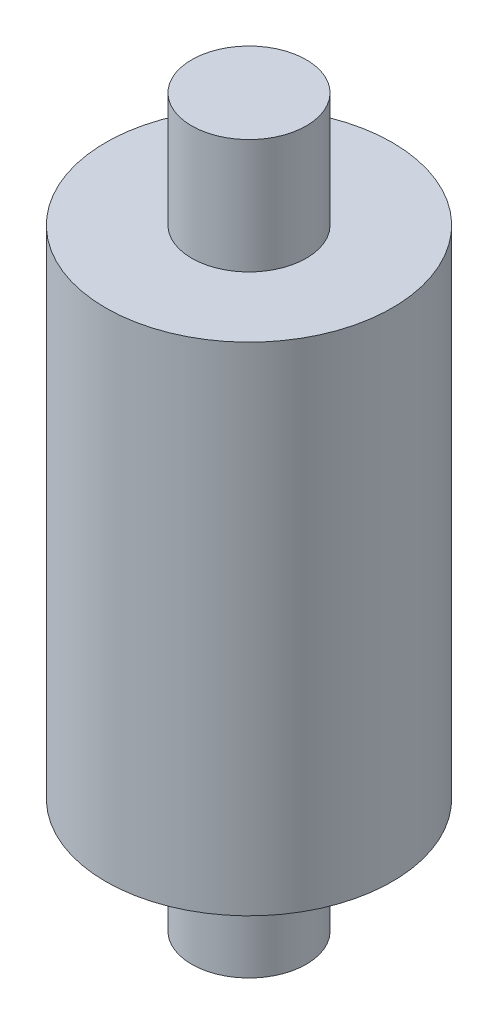
ISO-10303-21;
HEADER;
FILE_DESCRIPTION(('STEP AP214'),'2;1');
FILE_NAME('part.step','',(''),(''),'','','');
FILE_SCHEMA(('AUTOMOTIVE_DESIGN { 1 0 10303 214 1 1 1 1 }'));
ENDSEC;
DATA;
#1=APPLICATION_CONTEXT('core data for automotive mechanical design processes');
#2=APPLICATION_PROTOCOL_DEFINITION('international standard','automotive_design',2000,#1);
#3=PRODUCT_CONTEXT('',#1,'mechanical');
#4=PRODUCT('Part','Part','',(#3));
#5=PRODUCT_RELATED_PRODUCT_CATEGORY('part','',(#4));
#6=PRODUCT_DEFINITION_FORMATION('','',#4);
#7=PRODUCT_DEFINITION_CONTEXT('part definition',#1,'design');
#8=PRODUCT_DEFINITION('design','',#6,#7);
#9=PRODUCT_DEFINITION_SHAPE('','',#8);
#10=(LENGTH_UNIT() NAMED_UNIT(*) SI_UNIT(.MILLI.,.METRE.));
#11=(NAMED_UNIT(*) PLANE_ANGLE_UNIT() SI_UNIT($,.RADIAN.));
#12=(NAMED_UNIT(*) SI_UNIT($,.STERADIAN.) SOLID_ANGLE_UNIT());
#13=UNCERTAINTY_MEASURE_WITH_UNIT(LENGTH_MEASURE(1.E-05),#10,'distance_accuracy_value','');
#14=(GEOMETRIC_REPRESENTATION_CONTEXT(3) GLOBAL_UNCERTAINTY_ASSIGNED_CONTEXT((#13)) GLOBAL_UNIT_ASSIGNED_CONTEXT((#10,
#11,#12)) REPRESENTATION_CONTEXT('',''));
#15=CARTESIAN_POINT('',(0.,0.,0.));
#16=DIRECTION('',(0.,0.,1.));
#17=DIRECTION('',(1.,0.,0.));
#18=AXIS2_PLACEMENT_3D('',#15,#16,#17);
#19=CARTESIAN_POINT('',(0.,19.,0.));
#20=DIRECTION('',(0.,-1.,0.));
#21=DIRECTION('',(0.,0.,-1.));
#22=AXIS2_PLACEMENT_3D('',#19,#20,#21);
#23=CYLINDRICAL_SURFACE('',#22,3.);
#24=CARTESIAN_POINT('',(0.,13.,0.));
#25=DIRECTION('',(0.,1.,0.));
#26=DIRECTION('',(0.,0.,1.));
#27=AXIS2_PLACEMENT_3D('',#24,#25,#26);
#28=CIRCLE('',#27,3.);
#29=CARTESIAN_POINT('',(0.,13.,3.));
#30=VERTEX_POINT('',#29);
#31=EDGE_CURVE('E61',#30,#30,#28,.T.);
#32=ORIENTED_EDGE('',*,*,#31,.T.);
#33=EDGE_LOOP('',(#32));
#34=FACE_BOUND('',#33,.T.);
#35=CARTESIAN_POINT('',(0.,19.,0.));
#36=DIRECTION('',(0.,1.,0.));
#37=DIRECTION('',(0.,0.,1.));
#38=AXIS2_PLACEMENT_3D('',#35,#36,#37);
#39=CIRCLE('',#38,3.);
#40=CARTESIAN_POINT('',(0.,19.,3.));
#41=VERTEX_POINT('',#40);
#42=EDGE_CURVE('E44',#41,#41,#39,.T.);
#43=ORIENTED_EDGE('',*,*,#42,.F.);
#44=EDGE_LOOP('',(#43));
#45=FACE_BOUND('',#44,.T.);
#46=ADVANCED_FACE('F37',(#34,#45),#23,.T.);
#47=CARTESIAN_POINT('',(0.,19.,0.));
#48=DIRECTION('',(0.,1.,0.));
#49=DIRECTION('',(0.,0.,1.));
#50=AXIS2_PLACEMENT_3D('',#47,#48,#49);
#51=PLANE('',#50);
#52=ORIENTED_EDGE('',*,*,#42,.T.);
#53=EDGE_LOOP('',(#52));
#54=FACE_BOUND('',#53,.T.);
#55=ADVANCED_FACE('F74',(#54),#51,.T.);
#56=CARTESIAN_POINT('',(0.,13.,0.));
#57=DIRECTION('',(0.,1.,0.));
#58=DIRECTION('',(0.,0.,1.));
#59=AXIS2_PLACEMENT_3D('',#56,#57,#58);
#60=PLANE('',#59);
#61=CARTESIAN_POINT('',(0.,13.,0.));
#62=DIRECTION('',(0.,1.,0.));
#63=DIRECTION('',(0.,0.,1.));
#64=AXIS2_PLACEMENT_3D('',#61,#62,#63);
#65=CIRCLE('',#64,7.5);
#66=CARTESIAN_POINT('',(0.,13.,-7.5));
#67=VERTEX_POINT('',#66);
#68=EDGE_CURVE('E55',#67,#67,#65,.T.);
#69=ORIENTED_EDGE('',*,*,#68,.T.);
#70=EDGE_LOOP('',(#69));
#71=FACE_BOUND('',#70,.T.);
#72=ORIENTED_EDGE('',*,*,#31,.F.);
#73=EDGE_LOOP('',(#72));
#74=FACE_BOUND('',#73,.T.);
#75=ADVANCED_FACE('F71',(#71,#74),#60,.T.);
#76=CARTESIAN_POINT('',(0.,-13.,0.));
#77=DIRECTION('',(0.,1.,0.));
#78=DIRECTION('',(0.,0.,1.));
#79=AXIS2_PLACEMENT_3D('',#76,#77,#78);
#80=PLANE('',#79);
#81=CARTESIAN_POINT('',(0.,-13.,0.));
#82=DIRECTION('',(0.,1.,0.));
#83=DIRECTION('',(0.,0.,1.));
#84=AXIS2_PLACEMENT_3D('',#81,#82,#83);
#85=CIRCLE('',#84,7.5);
#86=CARTESIAN_POINT('',(0.,-13.,-7.5));
#87=VERTEX_POINT('',#86);
#88=EDGE_CURVE('E57',#87,#87,#85,.T.);
#89=ORIENTED_EDGE('',*,*,#88,.F.);
#90=EDGE_LOOP('',(#89));
#91=FACE_BOUND('',#90,.T.);
#92=CARTESIAN_POINT('',(0.,-13.,0.));
#93=DIRECTION('',(0.,1.,0.));
#94=DIRECTION('',(0.,0.,1.));
#95=AXIS2_PLACEMENT_3D('',#92,#93,#94);
#96=CIRCLE('',#95,3.);
#97=CARTESIAN_POINT('',(0.,-13.,3.));
#98=VERTEX_POINT('',#97);
#99=EDGE_CURVE('E10',#98,#98,#96,.T.);
#100=ORIENTED_EDGE('',*,*,#99,.T.);
#101=EDGE_LOOP('',(#100));
#102=FACE_BOUND('',#101,.T.);
#103=ADVANCED_FACE('F73',(#91,#102),#80,.F.);
#104=CARTESIAN_POINT('',(0.,13.,0.));
#105=DIRECTION('',(0.,-1.,0.));
#106=DIRECTION('',(0.,0.,-1.));
#107=AXIS2_PLACEMENT_3D('',#104,#105,#106);
#108=CYLINDRICAL_SURFACE('',#107,7.5);
#109=CARTESIAN_POINT('',(0.,13.,-7.5));
#110=CARTESIAN_POINT('',(0.,12.7291666666667,-7.5));
#111=CARTESIAN_POINT('',(0.,12.4583333333333,-7.5));
#112=CARTESIAN_POINT('',(0.,11.9166666666667,-7.5));
#113=CARTESIAN_POINT('',(0.,11.6458333333333,-7.5));
#114=CARTESIAN_POINT('',(0.,11.1041666666667,-7.5));
#115=CARTESIAN_POINT('',(0.,10.8333333333333,-7.5));
#116=CARTESIAN_POINT('',(0.,10.2916666666667,-7.5));
#117=CARTESIAN_POINT('',(0.,10.0208333333333,-7.5));
#118=CARTESIAN_POINT('',(0.,9.47916666666667,-7.5));
#119=CARTESIAN_POINT('',(0.,9.20833333333333,-7.5));
#120=CARTESIAN_POINT('',(0.,8.66666666666667,-7.5));
#121=CARTESIAN_POINT('',(0.,8.39583333333333,-7.5));
#122=CARTESIAN_POINT('',(0.,7.85416666666667,-7.5));
#123=CARTESIAN_POINT('',(0.,7.58333333333333,-7.5));
#124=CARTESIAN_POINT('',(0.,7.04166666666667,-7.5));
#125=CARTESIAN_POINT('',(0.,6.77083333333333,-7.5));
#126=CARTESIAN_POINT('',(0.,6.22916666666667,-7.5));
#127=CARTESIAN_POINT('',(0.,5.95833333333333,-7.5));
#128=CARTESIAN_POINT('',(0.,5.41666666666667,-7.5));
#129=CARTESIAN_POINT('',(0.,5.14583333333333,-7.5));
#130=CARTESIAN_POINT('',(0.,4.60416666666667,-7.5));
#131=CARTESIAN_POINT('',(0.,4.33333333333333,-7.5));
#132=CARTESIAN_POINT('',(0.,3.79166666666667,-7.5));
#133=CARTESIAN_POINT('',(0.,3.52083333333333,-7.5));
#134=CARTESIAN_POINT('',(0.,2.97916666666667,-7.5));
#135=CARTESIAN_POINT('',(0.,2.70833333333333,-7.5));
#136=CARTESIAN_POINT('',(0.,2.16666666666667,-7.5));
#137=CARTESIAN_POINT('',(0.,1.89583333333333,-7.5));
#138=CARTESIAN_POINT('',(0.,1.35416666666667,-7.5));
#139=CARTESIAN_POINT('',(0.,1.08333333333333,-7.5));
#140=CARTESIAN_POINT('',(0.,0.541666666666667,-7.5));
#141=CARTESIAN_POINT('',(0.,0.270833333333333,-7.5));
#142=CARTESIAN_POINT('',(0.,-0.270833333333333,-7.5));
#143=CARTESIAN_POINT('',(0.,-0.541666666666667,-7.5));
#144=CARTESIAN_POINT('',(0.,-1.08333333333333,-7.5));
#145=CARTESIAN_POINT('',(0.,-1.35416666666667,-7.5));
#146=CARTESIAN_POINT('',(0.,-1.89583333333333,-7.5));
#147=CARTESIAN_POINT('',(0.,-2.16666666666667,-7.5));
#148=CARTESIAN_POINT('',(0.,-2.70833333333333,-7.5));
#149=CARTESIAN_POINT('',(0.,-2.97916666666667,-7.5));
#150=CARTESIAN_POINT('',(0.,-3.52083333333333,-7.5));
#151=CARTESIAN_POINT('',(0.,-3.79166666666667,-7.5));
#152=CARTESIAN_POINT('',(0.,-4.33333333333333,-7.5));
#153=CARTESIAN_POINT('',(0.,-4.60416666666667,-7.5));
#154=CARTESIAN_POINT('',(0.,-5.14583333333333,-7.5));
#155=CARTESIAN_POINT('',(0.,-5.41666666666667,-7.5));
#156=CARTESIAN_POINT('',(0.,-5.95833333333333,-7.5));
#157=CARTESIAN_POINT('',(0.,-6.22916666666667,-7.5));
#158=CARTESIAN_POINT('',(0.,-6.77083333333333,-7.5));
#159=CARTESIAN_POINT('',(0.,-7.04166666666667,-7.5));
#160=CARTESIAN_POINT('',(0.,-7.58333333333333,-7.5));
#161=CARTESIAN_POINT('',(0.,-7.85416666666667,-7.5));
#162=CARTESIAN_POINT('',(0.,-8.39583333333333,-7.5));
#163=CARTESIAN_POINT('',(0.,-8.66666666666667,-7.5));
#164=CARTESIAN_POINT('',(0.,-9.20833333333333,-7.5));
#165=CARTESIAN_POINT('',(0.,-9.47916666666667,-7.5));
#166=CARTESIAN_POINT('',(0.,-10.0208333333333,-7.5));
#167=CARTESIAN_POINT('',(0.,-10.2916666666667,-7.5));
#168=CARTESIAN_POINT('',(0.,-10.8333333333333,-7.5));
#169=CARTESIAN_POINT('',(0.,-11.1041666666667,-7.5));
#170=CARTESIAN_POINT('',(0.,-11.6458333333333,-7.5));
#171=CARTESIAN_POINT('',(0.,-11.9166666666667,-7.5));
#172=CARTESIAN_POINT('',(0.,-12.4583333333333,-7.5));
#173=CARTESIAN_POINT('',(0.,-12.7291666666667,-7.5));
#174=CARTESIAN_POINT('',(0.,-13.,-7.5));
#175=B_SPLINE_CURVE_WITH_KNOTS('',3,(#109,#110,#111,#112,#113,#114,#115,#116,#117,#118,#119,
#120,#121,#122,#123,#124,#125,#126,#127,#128,#129,#130,#131,#132,#133,#134,#135,#136,#137,#138,
#139,#140,#141,#142,#143,#144,#145,#146,#147,#148,#149,#150,#151,#152,#153,#154,#155,#156,#157,
#158,#159,#160,#161,#162,#163,#164,#165,#166,#167,#168,#169,#170,#171,#172,#173,#174),
.UNSPECIFIED.,.F.,.F.,(4,2,2,2,2,2,2,2,2,2,2,2,2,2,2,2,2,2,2,2,2,2,2,2,2,2,2,2,2,2,2,2,4),(0.,
0.812500000000001,1.625,2.4375,3.25,4.0625,4.875,5.6875,6.5,7.3125,8.125,8.9375,9.75,10.5625,
11.375,12.1875,13.,13.8125,14.625,15.4375,16.25,17.0625,17.875,18.6875,19.5,20.3125,21.125,
21.9375,22.75,23.5625,24.375,25.1875,26.),.UNSPECIFIED.);
#176=EDGE_CURVE('BSEAM81',#67,#87,#175,.T.);
#177=ORIENTED_EDGE('',*,*,#68,.F.);
#178=ORIENTED_EDGE('',*,*,#88,.T.);
#179=ORIENTED_EDGE('',*,*,#176,.T.);
#180=ORIENTED_EDGE('',*,*,#176,.F.);
#181=EDGE_LOOP('',(#177,#179,#178,#180));
#182=FACE_BOUND('',#181,.T.);
#183=ADVANCED_FACE('F81',(#182),#108,.T.);
#184=CARTESIAN_POINT('',(0.,-19.,0.));
#185=DIRECTION('',(0.,1.,0.));
#186=DIRECTION('',(0.,0.,1.));
#187=AXIS2_PLACEMENT_3D('',#184,#185,#186);
#188=PLANE('',#187);
#189=CARTESIAN_POINT('',(0.,-19.,0.));
#190=DIRECTION('',(0.,1.,0.));
#191=DIRECTION('',(0.,0.,1.));
#192=AXIS2_PLACEMENT_3D('',#189,#190,#191);
#193=CIRCLE('',#192,3.);
#194=CARTESIAN_POINT('',(0.,-19.,3.));
#195=VERTEX_POINT('',#194);
#196=EDGE_CURVE('E49',#195,#195,#193,.T.);
#197=ORIENTED_EDGE('',*,*,#196,.F.);
#198=EDGE_LOOP('',(#197));
#199=FACE_BOUND('',#198,.T.);
#200=ADVANCED_FACE('F90',(#199),#188,.F.);
#201=ORIENTED_EDGE('',*,*,#196,.T.);
#202=EDGE_LOOP('',(#201));
#203=FACE_BOUND('',#202,.T.);
#204=ORIENTED_EDGE('',*,*,#99,.F.);
#205=EDGE_LOOP('',(#204));
#206=FACE_BOUND('',#205,.T.);
#207=ADVANCED_FACE('F86',(#203,#206),#23,.T.);
#208=CLOSED_SHELL('',(#46,#55,#75,#103,#183,#200,#207));
#209=MANIFOLD_SOLID_BREP('B2',#208);
#210=ADVANCED_BREP_SHAPE_REPRESENTATION('',(#18,#209),#14);
#211=SHAPE_DEFINITION_REPRESENTATION(#9,#210);
ENDSEC;
END-ISO-10303-21;
